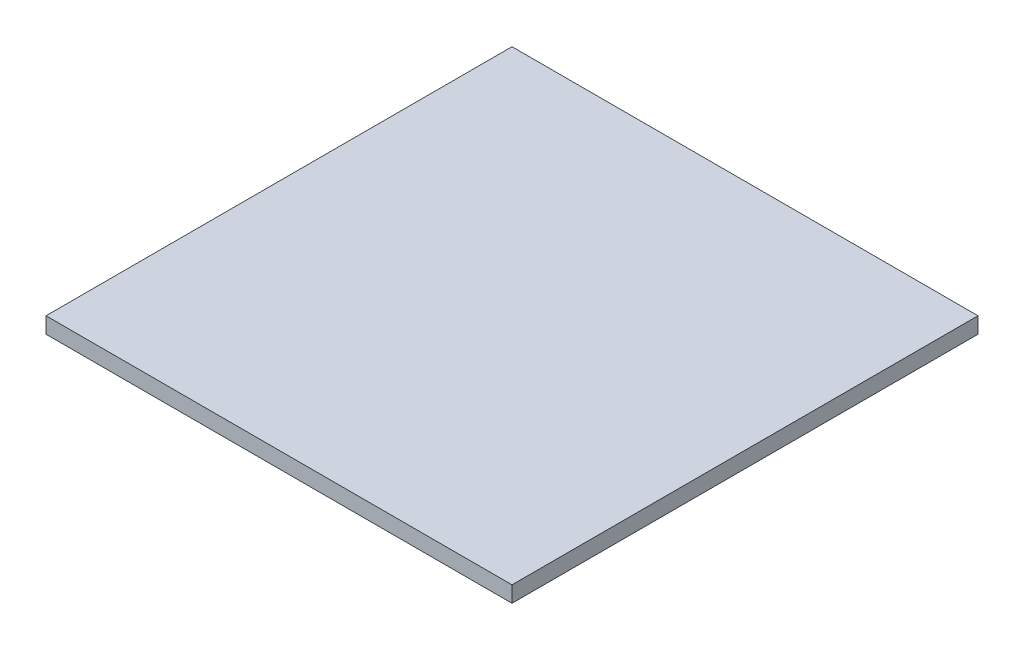
ISO-10303-21;
HEADER;
FILE_DESCRIPTION(('STEP AP214'),'2;1');
FILE_NAME('part.step','',(''),(''),'','','');
FILE_SCHEMA(('AUTOMOTIVE_DESIGN { 1 0 10303 214 1 1 1 1 }'));
ENDSEC;
DATA;
#1=APPLICATION_CONTEXT('core data for automotive mechanical design processes');
#2=APPLICATION_PROTOCOL_DEFINITION('international standard','automotive_design',2000,#1);
#3=PRODUCT_CONTEXT('',#1,'mechanical');
#4=PRODUCT('Part','Part','',(#3));
#5=PRODUCT_RELATED_PRODUCT_CATEGORY('part','',(#4));
#6=PRODUCT_DEFINITION_FORMATION('','',#4);
#7=PRODUCT_DEFINITION_CONTEXT('part definition',#1,'design');
#8=PRODUCT_DEFINITION('design','',#6,#7);
#9=PRODUCT_DEFINITION_SHAPE('','',#8);
#10=(LENGTH_UNIT() NAMED_UNIT(*) SI_UNIT(.MILLI.,.METRE.));
#11=(NAMED_UNIT(*) PLANE_ANGLE_UNIT() SI_UNIT($,.RADIAN.));
#12=(NAMED_UNIT(*) SI_UNIT($,.STERADIAN.) SOLID_ANGLE_UNIT());
#13=UNCERTAINTY_MEASURE_WITH_UNIT(LENGTH_MEASURE(1.E-05),#10,'distance_accuracy_value','');
#14=(GEOMETRIC_REPRESENTATION_CONTEXT(3) GLOBAL_UNCERTAINTY_ASSIGNED_CONTEXT((#13)) GLOBAL_UNIT_ASSIGNED_CONTEXT((#10,
#11,#12)) REPRESENTATION_CONTEXT('',''));
#15=CARTESIAN_POINT('',(0.,0.,0.));
#16=DIRECTION('',(0.,0.,1.));
#17=DIRECTION('',(1.,0.,0.));
#18=AXIS2_PLACEMENT_3D('',#15,#16,#17);
#19=CARTESIAN_POINT('',(-254.,17.4625,0.));
#20=DIRECTION('',(-1.,0.,0.));
#21=DIRECTION('',(0.,0.,1.));
#22=AXIS2_PLACEMENT_3D('',#19,#20,#21);
#23=PLANE('',#22);
#24=DIRECTION('',(0.,0.,-1.));
#25=VECTOR('',#24,1.);
#26=CARTESIAN_POINT('',(-254.,0.,0.));
#27=LINE('',#26,#25);
#28=CARTESIAN_POINT('',(-254.,0.,254.));
#29=VERTEX_POINT('',#28);
#30=CARTESIAN_POINT('',(-254.,0.,-254.));
#31=VERTEX_POINT('',#30);
#32=EDGE_CURVE('E114',#29,#31,#27,.T.);
#33=ORIENTED_EDGE('',*,*,#32,.F.);
#34=DIRECTION('',(0.,-1.,0.));
#35=VECTOR('',#34,1.);
#36=CARTESIAN_POINT('',(-254.,17.4625,254.));
#37=LINE('',#36,#35);
#38=CARTESIAN_POINT('',(-254.,17.4625,254.));
#39=VERTEX_POINT('',#38);
#40=EDGE_CURVE('E11',#39,#29,#37,.T.);
#41=ORIENTED_EDGE('',*,*,#40,.F.);
#42=DIRECTION('',(0.,0.,-1.));
#43=VECTOR('',#42,1.);
#44=CARTESIAN_POINT('',(-254.,17.4625,0.));
#45=LINE('',#44,#43);
#46=CARTESIAN_POINT('',(-254.,17.4625,-254.));
#47=VERTEX_POINT('',#46);
#48=EDGE_CURVE('E105',#39,#47,#45,.T.);
#49=ORIENTED_EDGE('',*,*,#48,.T.);
#50=DIRECTION('',(0.,-1.,0.));
#51=VECTOR('',#50,1.);
#52=CARTESIAN_POINT('',(-254.,17.4625,-254.));
#53=LINE('',#52,#51);
#54=EDGE_CURVE('E84',#47,#31,#53,.T.);
#55=ORIENTED_EDGE('',*,*,#54,.T.);
#56=EDGE_LOOP('',(#33,#41,#49,#55));
#57=FACE_BOUND('',#56,.T.);
#58=ADVANCED_FACE('F45',(#57),#23,.T.);
#59=CARTESIAN_POINT('',(0.,17.4625,254.));
#60=DIRECTION('',(0.,0.,1.));
#61=DIRECTION('',(1.,0.,0.));
#62=AXIS2_PLACEMENT_3D('',#59,#60,#61);
#63=PLANE('',#62);
#64=DIRECTION('',(-1.,0.,0.));
#65=VECTOR('',#64,1.);
#66=CARTESIAN_POINT('',(0.,0.,254.));
#67=LINE('',#66,#65);
#68=CARTESIAN_POINT('',(254.,0.,254.));
#69=VERTEX_POINT('',#68);
#70=EDGE_CURVE('E97',#69,#29,#67,.T.);
#71=ORIENTED_EDGE('',*,*,#70,.F.);
#72=DIRECTION('',(0.,-1.,0.));
#73=VECTOR('',#72,1.);
#74=CARTESIAN_POINT('',(254.,17.4625,254.));
#75=LINE('',#74,#73);
#76=CARTESIAN_POINT('',(254.,17.4625,254.));
#77=VERTEX_POINT('',#76);
#78=EDGE_CURVE('E54',#77,#69,#75,.T.);
#79=ORIENTED_EDGE('',*,*,#78,.F.);
#80=DIRECTION('',(-1.,0.,0.));
#81=VECTOR('',#80,1.);
#82=CARTESIAN_POINT('',(0.,17.4625,254.));
#83=LINE('',#82,#81);
#84=EDGE_CURVE('E95',#77,#39,#83,.T.);
#85=ORIENTED_EDGE('',*,*,#84,.T.);
#86=ORIENTED_EDGE('',*,*,#40,.T.);
#87=EDGE_LOOP('',(#71,#79,#85,#86));
#88=FACE_BOUND('',#87,.T.);
#89=ADVANCED_FACE('F93',(#88),#63,.T.);
#90=CARTESIAN_POINT('',(254.,17.4625,0.));
#91=DIRECTION('',(-1.,0.,0.));
#92=DIRECTION('',(0.,0.,1.));
#93=AXIS2_PLACEMENT_3D('',#90,#91,#92);
#94=PLANE('',#93);
#95=DIRECTION('',(0.,0.,-1.));
#96=VECTOR('',#95,1.);
#97=CARTESIAN_POINT('',(254.,0.,0.));
#98=LINE('',#97,#96);
#99=CARTESIAN_POINT('',(254.,0.,-254.));
#100=VERTEX_POINT('',#99);
#101=EDGE_CURVE('E77',#69,#100,#98,.T.);
#102=ORIENTED_EDGE('',*,*,#101,.T.);
#103=DIRECTION('',(0.,-1.,0.));
#104=VECTOR('',#103,1.);
#105=CARTESIAN_POINT('',(254.,17.4625,-254.));
#106=LINE('',#105,#104);
#107=CARTESIAN_POINT('',(254.,17.4625,-254.));
#108=VERTEX_POINT('',#107);
#109=EDGE_CURVE('E99',#108,#100,#106,.T.);
#110=ORIENTED_EDGE('',*,*,#109,.F.);
#111=DIRECTION('',(0.,0.,-1.));
#112=VECTOR('',#111,1.);
#113=CARTESIAN_POINT('',(254.,17.4625,0.));
#114=LINE('',#113,#112);
#115=EDGE_CURVE('E100',#77,#108,#114,.T.);
#116=ORIENTED_EDGE('',*,*,#115,.F.);
#117=ORIENTED_EDGE('',*,*,#78,.T.);
#118=EDGE_LOOP('',(#102,#110,#116,#117));
#119=FACE_BOUND('',#118,.T.);
#120=ADVANCED_FACE('F101',(#119),#94,.F.);
#121=CARTESIAN_POINT('',(0.,17.4625,-254.));
#122=DIRECTION('',(0.,0.,1.));
#123=DIRECTION('',(1.,0.,0.));
#124=AXIS2_PLACEMENT_3D('',#121,#122,#123);
#125=PLANE('',#124);
#126=DIRECTION('',(-1.,0.,0.));
#127=VECTOR('',#126,1.);
#128=CARTESIAN_POINT('',(0.,0.,-254.));
#129=LINE('',#128,#127);
#130=EDGE_CURVE('E109',#100,#31,#129,.T.);
#131=ORIENTED_EDGE('',*,*,#130,.T.);
#132=ORIENTED_EDGE('',*,*,#54,.F.);
#133=DIRECTION('',(-1.,0.,0.));
#134=VECTOR('',#133,1.);
#135=CARTESIAN_POINT('',(0.,17.4625,-254.));
#136=LINE('',#135,#134);
#137=EDGE_CURVE('E62',#108,#47,#136,.T.);
#138=ORIENTED_EDGE('',*,*,#137,.F.);
#139=ORIENTED_EDGE('',*,*,#109,.T.);
#140=EDGE_LOOP('',(#131,#132,#138,#139));
#141=FACE_BOUND('',#140,.T.);
#142=ADVANCED_FACE('F129',(#141),#125,.F.);
#143=CARTESIAN_POINT('',(0.,17.4625,0.));
#144=DIRECTION('',(0.,1.,0.));
#145=DIRECTION('',(0.,0.,1.));
#146=AXIS2_PLACEMENT_3D('',#143,#144,#145);
#147=PLANE('',#146);
#148=ORIENTED_EDGE('',*,*,#48,.F.);
#149=ORIENTED_EDGE('',*,*,#84,.F.);
#150=ORIENTED_EDGE('',*,*,#115,.T.);
#151=ORIENTED_EDGE('',*,*,#137,.T.);
#152=EDGE_LOOP('',(#148,#149,#150,#151));
#153=FACE_BOUND('',#152,.T.);
#154=ADVANCED_FACE('F104',(#153),#147,.T.);
#155=CARTESIAN_POINT('',(0.,0.,0.));
#156=DIRECTION('',(0.,1.,0.));
#157=DIRECTION('',(0.,0.,1.));
#158=AXIS2_PLACEMENT_3D('',#155,#156,#157);
#159=PLANE('',#158);
#160=ORIENTED_EDGE('',*,*,#32,.T.);
#161=ORIENTED_EDGE('',*,*,#130,.F.);
#162=ORIENTED_EDGE('',*,*,#101,.F.);
#163=ORIENTED_EDGE('',*,*,#70,.T.);
#164=EDGE_LOOP('',(#160,#161,#162,#163));
#165=FACE_BOUND('',#164,.T.);
#166=ADVANCED_FACE('F131',(#165),#159,.F.);
#167=CLOSED_SHELL('',(#58,#89,#120,#142,#154,#166));
#168=MANIFOLD_SOLID_BREP('B2',#167);
#169=ADVANCED_BREP_SHAPE_REPRESENTATION('',(#18,#168),#14);
#170=SHAPE_DEFINITION_REPRESENTATION(#9,#169);
ENDSEC;
END-ISO-10303-21;
